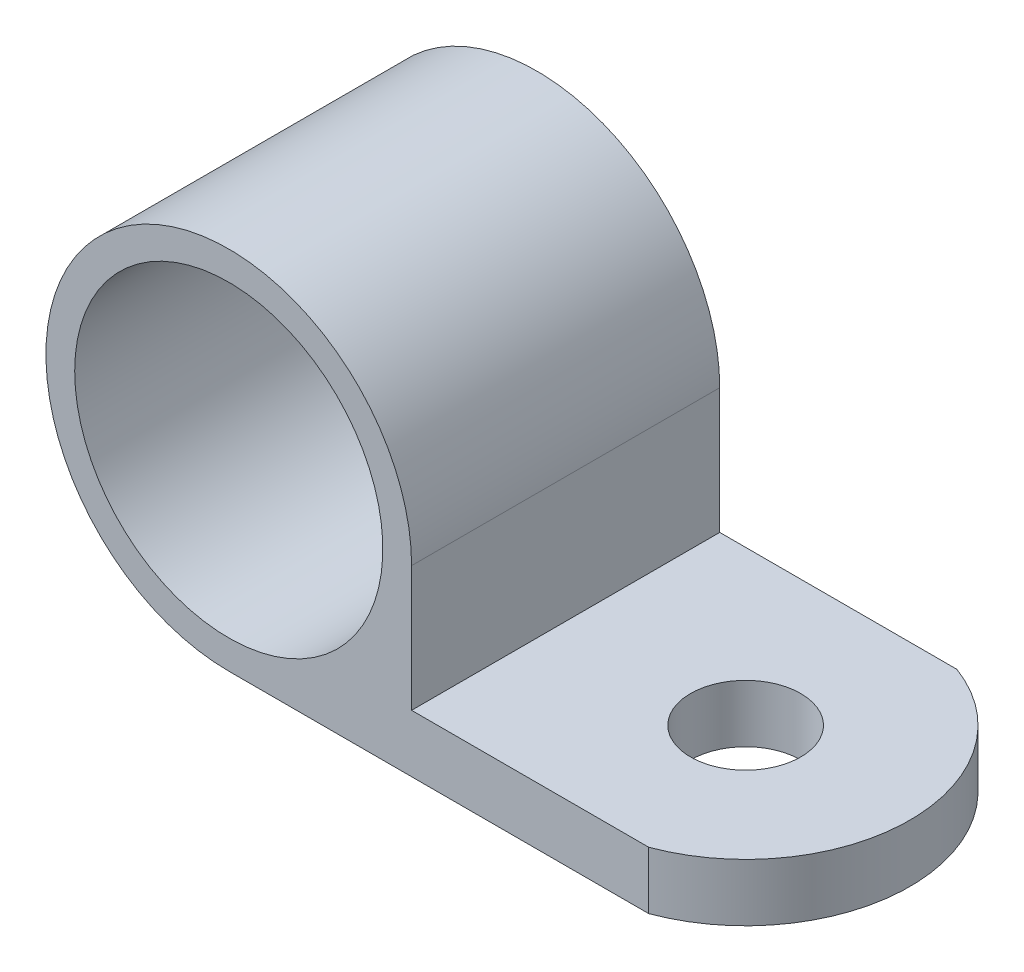
ISO-10303-21;
HEADER;
FILE_DESCRIPTION(('STEP AP214'),'2;1');
FILE_NAME('part.step','',(''),(''),'','','');
FILE_SCHEMA(('AUTOMOTIVE_DESIGN { 1 0 10303 214 1 1 1 1 }'));
ENDSEC;
DATA;
#1=APPLICATION_CONTEXT('core data for automotive mechanical design processes');
#2=APPLICATION_PROTOCOL_DEFINITION('international standard','automotive_design',2000,#1);
#3=PRODUCT_CONTEXT('',#1,'mechanical');
#4=PRODUCT('Part','Part','',(#3));
#5=PRODUCT_RELATED_PRODUCT_CATEGORY('part','',(#4));
#6=PRODUCT_DEFINITION_FORMATION('','',#4);
#7=PRODUCT_DEFINITION_CONTEXT('part definition',#1,'design');
#8=PRODUCT_DEFINITION('design','',#6,#7);
#9=PRODUCT_DEFINITION_SHAPE('','',#8);
#10=(LENGTH_UNIT() NAMED_UNIT(*) SI_UNIT(.MILLI.,.METRE.));
#11=(NAMED_UNIT(*) PLANE_ANGLE_UNIT() SI_UNIT($,.RADIAN.));
#12=(NAMED_UNIT(*) SI_UNIT($,.STERADIAN.) SOLID_ANGLE_UNIT());
#13=UNCERTAINTY_MEASURE_WITH_UNIT(LENGTH_MEASURE(1.E-05),#10,'distance_accuracy_value','');
#14=(GEOMETRIC_REPRESENTATION_CONTEXT(3) GLOBAL_UNCERTAINTY_ASSIGNED_CONTEXT((#13)) GLOBAL_UNIT_ASSIGNED_CONTEXT((#10,
#11,#12)) REPRESENTATION_CONTEXT('',''));
#15=CARTESIAN_POINT('',(0.,0.,0.));
#16=DIRECTION('',(0.,0.,1.));
#17=DIRECTION('',(1.,0.,0.));
#18=AXIS2_PLACEMENT_3D('',#15,#16,#17);
#19=CARTESIAN_POINT('',(-5.5626,1.778,4.7625));
#20=DIRECTION('',(0.,-1.,0.));
#21=DIRECTION('',(1.,0.,0.));
#22=AXIS2_PLACEMENT_3D('',#19,#20,#21);
#23=PLANE('',#22);
#24=CARTESIAN_POINT('',(0.,1.778,0.));
#25=DIRECTION('',(0.,-1.,0.));
#26=DIRECTION('',(1.,0.,0.));
#27=AXIS2_PLACEMENT_3D('',#24,#25,#26);
#28=CIRCLE('',#27,1.7018);
#29=CARTESIAN_POINT('',(0.,1.778,-1.7018));
#30=VERTEX_POINT('',#29);
#31=EDGE_CURVE('E130',#30,#30,#28,.F.);
#32=ORIENTED_EDGE('',*,*,#31,.F.);
#33=EDGE_LOOP('',(#32));
#34=FACE_BOUND('',#33,.T.);
#35=CARTESIAN_POINT('',(0.,1.778,0.));
#36=DIRECTION('',(0.,-1.,0.));
#37=DIRECTION('',(1.,0.,0.));
#38=AXIS2_PLACEMENT_3D('',#35,#36,#37);
#39=CIRCLE('',#38,5.08);
#40=CARTESIAN_POINT('',(1.76776518519853,1.778,-4.7625));
#41=VERTEX_POINT('',#40);
#42=CARTESIAN_POINT('',(1.76776518519853,1.778,4.7625));
#43=VERTEX_POINT('',#42);
#44=EDGE_CURVE('E89',#41,#43,#39,.T.);
#45=ORIENTED_EDGE('',*,*,#44,.F.);
#46=DIRECTION('',(-1.,0.,0.));
#47=VECTOR('',#46,1.);
#48=CARTESIAN_POINT('',(-5.5626,1.778,-4.7625));
#49=LINE('',#48,#47);
#50=CARTESIAN_POINT('',(-5.5626,1.778,-4.7625));
#51=VERTEX_POINT('',#50);
#52=EDGE_CURVE('E109',#41,#51,#49,.T.);
#53=ORIENTED_EDGE('',*,*,#52,.T.);
#54=DIRECTION('',(0.,0.,-1.));
#55=VECTOR('',#54,1.);
#56=CARTESIAN_POINT('',(-5.5626,1.778,4.7625));
#57=LINE('',#56,#55);
#58=CARTESIAN_POINT('',(-5.5626,1.778,4.7625));
#59=VERTEX_POINT('',#58);
#60=EDGE_CURVE('E41',#59,#51,#57,.T.);
#61=ORIENTED_EDGE('',*,*,#60,.F.);
#62=DIRECTION('',(-1.,0.,0.));
#63=VECTOR('',#62,1.);
#64=CARTESIAN_POINT('',(-5.5626,1.778,4.7625));
#65=LINE('',#64,#63);
#66=EDGE_CURVE('E78',#43,#59,#65,.T.);
#67=ORIENTED_EDGE('',*,*,#66,.F.);
#68=EDGE_LOOP('',(#45,#53,#61,#67));
#69=FACE_BOUND('',#68,.T.);
#70=ADVANCED_FACE('F34',(#34,#69),#23,.F.);
#71=CARTESIAN_POINT('',(6.35,0.,4.7625));
#72=DIRECTION('',(0.,1.,0.));
#73=DIRECTION('',(-1.,0.,0.));
#74=AXIS2_PLACEMENT_3D('',#71,#72,#73);
#75=PLANE('',#74);
#76=CARTESIAN_POINT('',(0.,0.,0.));
#77=DIRECTION('',(0.,1.,0.));
#78=DIRECTION('',(0.,0.,1.));
#79=AXIS2_PLACEMENT_3D('',#76,#77,#78);
#80=CIRCLE('',#79,1.7018);
#81=CARTESIAN_POINT('',(0.,0.,-1.7018));
#82=VERTEX_POINT('',#81);
#83=EDGE_CURVE('E90',#82,#82,#80,.T.);
#84=ORIENTED_EDGE('',*,*,#83,.T.);
#85=EDGE_LOOP('',(#84));
#86=FACE_BOUND('',#85,.T.);
#87=CARTESIAN_POINT('',(0.,0.,0.));
#88=DIRECTION('',(0.,-1.,0.));
#89=DIRECTION('',(0.,0.,1.));
#90=AXIS2_PLACEMENT_3D('',#87,#88,#89);
#91=CIRCLE('',#90,5.08);
#92=CARTESIAN_POINT('',(1.76776518519853,0.,-4.7625));
#93=VERTEX_POINT('',#92);
#94=CARTESIAN_POINT('',(1.76776518519853,0.,4.7625));
#95=VERTEX_POINT('',#94);
#96=EDGE_CURVE('E48',#93,#95,#91,.T.);
#97=ORIENTED_EDGE('',*,*,#96,.T.);
#98=DIRECTION('',(1.,0.,0.));
#99=VECTOR('',#98,1.);
#100=CARTESIAN_POINT('',(6.35,0.,4.7625));
#101=LINE('',#100,#99);
#102=CARTESIAN_POINT('',(-11.2141,0.,4.7625));
#103=VERTEX_POINT('',#102);
#104=EDGE_CURVE('E96',#103,#95,#101,.T.);
#105=ORIENTED_EDGE('',*,*,#104,.F.);
#106=DIRECTION('',(0.,0.,-1.));
#107=VECTOR('',#106,1.);
#108=CARTESIAN_POINT('',(-11.2141,0.,4.7625));
#109=LINE('',#108,#107);
#110=CARTESIAN_POINT('',(-11.2141,0.,-4.7625));
#111=VERTEX_POINT('',#110);
#112=EDGE_CURVE('E101',#103,#111,#109,.T.);
#113=ORIENTED_EDGE('',*,*,#112,.T.);
#114=DIRECTION('',(1.,0.,0.));
#115=VECTOR('',#114,1.);
#116=CARTESIAN_POINT('',(6.35,0.,-4.7625));
#117=LINE('',#116,#115);
#118=EDGE_CURVE('E98',#111,#93,#117,.T.);
#119=ORIENTED_EDGE('',*,*,#118,.T.);
#120=EDGE_LOOP('',(#97,#105,#113,#119));
#121=FACE_BOUND('',#120,.T.);
#122=ADVANCED_FACE('F95',(#86,#121),#75,.F.);
#123=CARTESIAN_POINT('',(-11.2141,5.6515,4.7625));
#124=DIRECTION('',(0.,0.,-1.));
#125=DIRECTION('',(-1.,0.,0.));
#126=AXIS2_PLACEMENT_3D('',#123,#124,#125);
#127=PLANE('',#126);
#128=CARTESIAN_POINT('',(-11.2141,5.6515,4.7625));
#129=DIRECTION('',(0.,0.,1.));
#130=DIRECTION('',(1.,0.,0.));
#131=AXIS2_PLACEMENT_3D('',#128,#129,#130);
#132=CIRCLE('',#131,4.7625);
#133=CARTESIAN_POINT('',(-15.9766,5.6515,4.7625));
#134=VERTEX_POINT('',#133);
#135=EDGE_CURVE('E112',#134,#134,#132,.T.);
#136=ORIENTED_EDGE('',*,*,#135,.F.);
#137=EDGE_LOOP('',(#136));
#138=FACE_BOUND('',#137,.T.);
#139=DIRECTION('',(0.,-1.,0.));
#140=VECTOR('',#139,1.);
#141=CARTESIAN_POINT('',(1.76776518519853,11.303,4.7625));
#142=LINE('',#141,#140);
#143=EDGE_CURVE('E86',#43,#95,#142,.T.);
#144=ORIENTED_EDGE('',*,*,#143,.F.);
#145=ORIENTED_EDGE('',*,*,#66,.T.);
#146=DIRECTION('',(0.,1.,0.));
#147=VECTOR('',#146,1.);
#148=CARTESIAN_POINT('',(-5.5626,5.6515,4.7625));
#149=LINE('',#148,#147);
#150=CARTESIAN_POINT('',(-5.5626,5.6515,4.7625));
#151=VERTEX_POINT('',#150);
#152=EDGE_CURVE('E105',#59,#151,#149,.T.);
#153=ORIENTED_EDGE('',*,*,#152,.T.);
#154=CARTESIAN_POINT('',(-11.2141,5.6515,4.7625));
#155=DIRECTION('',(0.,0.,1.));
#156=DIRECTION('',(-1.,0.,0.));
#157=AXIS2_PLACEMENT_3D('',#154,#155,#156);
#158=CIRCLE('',#157,5.6515);
#159=EDGE_CURVE('E56',#151,#103,#158,.T.);
#160=ORIENTED_EDGE('',*,*,#159,.T.);
#161=ORIENTED_EDGE('',*,*,#104,.T.);
#162=EDGE_LOOP('',(#144,#145,#153,#160,#161));
#163=FACE_BOUND('',#162,.T.);
#164=ADVANCED_FACE('F100',(#138,#163),#127,.F.);
#165=CARTESIAN_POINT('',(-11.2141,5.6515,-4.7625));
#166=DIRECTION('',(0.,0.,-1.));
#167=DIRECTION('',(-1.,0.,0.));
#168=AXIS2_PLACEMENT_3D('',#165,#166,#167);
#169=PLANE('',#168);
#170=CARTESIAN_POINT('',(-11.2141,5.6515,-4.7625));
#171=DIRECTION('',(0.,0.,1.));
#172=DIRECTION('',(1.,0.,0.));
#173=AXIS2_PLACEMENT_3D('',#170,#171,#172);
#174=CIRCLE('',#173,4.7625);
#175=CARTESIAN_POINT('',(-15.9766,5.6515,-4.7625));
#176=VERTEX_POINT('',#175);
#177=EDGE_CURVE('E133',#176,#176,#174,.T.);
#178=ORIENTED_EDGE('',*,*,#177,.T.);
#179=EDGE_LOOP('',(#178));
#180=FACE_BOUND('',#179,.T.);
#181=ORIENTED_EDGE('',*,*,#52,.F.);
#182=DIRECTION('',(0.,-1.,0.));
#183=VECTOR('',#182,1.);
#184=CARTESIAN_POINT('',(1.76776518519853,11.303,-4.7625));
#185=LINE('',#184,#183);
#186=EDGE_CURVE('E11',#41,#93,#185,.T.);
#187=ORIENTED_EDGE('',*,*,#186,.T.);
#188=ORIENTED_EDGE('',*,*,#118,.F.);
#189=CARTESIAN_POINT('',(-11.2141,5.6515,-4.7625));
#190=DIRECTION('',(0.,0.,1.));
#191=DIRECTION('',(-1.,0.,0.));
#192=AXIS2_PLACEMENT_3D('',#189,#190,#191);
#193=CIRCLE('',#192,5.6515);
#194=CARTESIAN_POINT('',(-5.5626,5.6515,-4.7625));
#195=VERTEX_POINT('',#194);
#196=EDGE_CURVE('E73',#195,#111,#193,.T.);
#197=ORIENTED_EDGE('',*,*,#196,.F.);
#198=DIRECTION('',(0.,1.,0.));
#199=VECTOR('',#198,1.);
#200=CARTESIAN_POINT('',(-5.5626,5.6515,-4.7625));
#201=LINE('',#200,#199);
#202=EDGE_CURVE('E111',#51,#195,#201,.T.);
#203=ORIENTED_EDGE('',*,*,#202,.F.);
#204=EDGE_LOOP('',(#181,#187,#188,#197,#203));
#205=FACE_BOUND('',#204,.T.);
#206=ADVANCED_FACE('F125',(#180,#205),#169,.T.);
#207=CARTESIAN_POINT('',(-5.5626,5.6515,4.7625));
#208=DIRECTION('',(-1.,0.,0.));
#209=DIRECTION('',(0.,0.,1.));
#210=AXIS2_PLACEMENT_3D('',#207,#208,#209);
#211=PLANE('',#210);
#212=ORIENTED_EDGE('',*,*,#202,.T.);
#213=DIRECTION('',(0.,0.,-1.));
#214=VECTOR('',#213,1.);
#215=CARTESIAN_POINT('',(-5.5626,5.6515,4.7625));
#216=LINE('',#215,#214);
#217=EDGE_CURVE('E103',#151,#195,#216,.T.);
#218=ORIENTED_EDGE('',*,*,#217,.F.);
#219=ORIENTED_EDGE('',*,*,#152,.F.);
#220=ORIENTED_EDGE('',*,*,#60,.T.);
#221=EDGE_LOOP('',(#212,#218,#219,#220));
#222=FACE_BOUND('',#221,.T.);
#223=ADVANCED_FACE('F120',(#222),#211,.F.);
#224=CARTESIAN_POINT('',(-11.2141,5.6515,4.7625));
#225=DIRECTION('',(0.,0.,-1.));
#226=DIRECTION('',(-1.,0.,0.));
#227=AXIS2_PLACEMENT_3D('',#224,#225,#226);
#228=CYLINDRICAL_SURFACE('',#227,5.6515);
#229=ORIENTED_EDGE('',*,*,#196,.T.);
#230=ORIENTED_EDGE('',*,*,#112,.F.);
#231=ORIENTED_EDGE('',*,*,#159,.F.);
#232=ORIENTED_EDGE('',*,*,#217,.T.);
#233=EDGE_LOOP('',(#229,#230,#231,#232));
#234=FACE_BOUND('',#233,.T.);
#235=ADVANCED_FACE('F138',(#234),#228,.T.);
#236=CARTESIAN_POINT('',(-11.2141,5.6515,4.7625));
#237=DIRECTION('',(0.,0.,-1.));
#238=DIRECTION('',(-1.,0.,0.));
#239=AXIS2_PLACEMENT_3D('',#236,#237,#238);
#240=CYLINDRICAL_SURFACE('',#239,4.7625);
#241=CARTESIAN_POINT('',(-15.9766,5.6515,4.7625));
#242=CARTESIAN_POINT('',(-15.9766,5.6515,4.66328125));
#243=CARTESIAN_POINT('',(-15.9766,5.6515,4.5640625));
#244=CARTESIAN_POINT('',(-15.9766,5.6515,4.365625));
#245=CARTESIAN_POINT('',(-15.9766,5.6515,4.26640625));
#246=CARTESIAN_POINT('',(-15.9766,5.6515,4.06796875));
#247=CARTESIAN_POINT('',(-15.9766,5.6515,3.96875));
#248=CARTESIAN_POINT('',(-15.9766,5.6515,3.7703125));
#249=CARTESIAN_POINT('',(-15.9766,5.6515,3.67109375));
#250=CARTESIAN_POINT('',(-15.9766,5.6515,3.47265625));
#251=CARTESIAN_POINT('',(-15.9766,5.6515,3.3734375));
#252=CARTESIAN_POINT('',(-15.9766,5.6515,3.175));
#253=CARTESIAN_POINT('',(-15.9766,5.6515,3.07578125));
#254=CARTESIAN_POINT('',(-15.9766,5.6515,2.87734375));
#255=CARTESIAN_POINT('',(-15.9766,5.6515,2.778125));
#256=CARTESIAN_POINT('',(-15.9766,5.6515,2.5796875));
#257=CARTESIAN_POINT('',(-15.9766,5.6515,2.48046875));
#258=CARTESIAN_POINT('',(-15.9766,5.6515,2.28203125));
#259=CARTESIAN_POINT('',(-15.9766,5.6515,2.1828125));
#260=CARTESIAN_POINT('',(-15.9766,5.6515,1.984375));
#261=CARTESIAN_POINT('',(-15.9766,5.6515,1.88515625));
#262=CARTESIAN_POINT('',(-15.9766,5.6515,1.68671875));
#263=CARTESIAN_POINT('',(-15.9766,5.6515,1.5875));
#264=CARTESIAN_POINT('',(-15.9766,5.6515,1.3890625));
#265=CARTESIAN_POINT('',(-15.9766,5.6515,1.28984375));
#266=CARTESIAN_POINT('',(-15.9766,5.6515,1.09140625));
#267=CARTESIAN_POINT('',(-15.9766,5.6515,0.992187499999999));
#268=CARTESIAN_POINT('',(-15.9766,5.6515,0.79375));
#269=CARTESIAN_POINT('',(-15.9766,5.6515,0.69453125));
#270=CARTESIAN_POINT('',(-15.9766,5.6515,0.49609375));
#271=CARTESIAN_POINT('',(-15.9766,5.6515,0.396875));
#272=CARTESIAN_POINT('',(-15.9766,5.6515,0.1984375));
#273=CARTESIAN_POINT('',(-15.9766,5.6515,0.0992187500000001));
#274=CARTESIAN_POINT('',(-15.9766,5.6515,-0.0992187500000001));
#275=CARTESIAN_POINT('',(-15.9766,5.6515,-0.1984375));
#276=CARTESIAN_POINT('',(-15.9766,5.6515,-0.396875));
#277=CARTESIAN_POINT('',(-15.9766,5.6515,-0.49609375));
#278=CARTESIAN_POINT('',(-15.9766,5.6515,-0.69453125));
#279=CARTESIAN_POINT('',(-15.9766,5.6515,-0.793750000000001));
#280=CARTESIAN_POINT('',(-15.9766,5.6515,-0.992187500000001));
#281=CARTESIAN_POINT('',(-15.9766,5.6515,-1.09140625));
#282=CARTESIAN_POINT('',(-15.9766,5.6515,-1.28984375));
#283=CARTESIAN_POINT('',(-15.9766,5.6515,-1.3890625));
#284=CARTESIAN_POINT('',(-15.9766,5.6515,-1.5875));
#285=CARTESIAN_POINT('',(-15.9766,5.6515,-1.68671875));
#286=CARTESIAN_POINT('',(-15.9766,5.6515,-1.88515625));
#287=CARTESIAN_POINT('',(-15.9766,5.6515,-1.984375));
#288=CARTESIAN_POINT('',(-15.9766,5.6515,-2.1828125));
#289=CARTESIAN_POINT('',(-15.9766,5.6515,-2.28203125));
#290=CARTESIAN_POINT('',(-15.9766,5.6515,-2.48046875));
#291=CARTESIAN_POINT('',(-15.9766,5.6515,-2.5796875));
#292=CARTESIAN_POINT('',(-15.9766,5.6515,-2.778125));
#293=CARTESIAN_POINT('',(-15.9766,5.6515,-2.87734375));
#294=CARTESIAN_POINT('',(-15.9766,5.6515,-3.07578125));
#295=CARTESIAN_POINT('',(-15.9766,5.6515,-3.175));
#296=CARTESIAN_POINT('',(-15.9766,5.6515,-3.3734375));
#297=CARTESIAN_POINT('',(-15.9766,5.6515,-3.47265625));
#298=CARTESIAN_POINT('',(-15.9766,5.6515,-3.67109375));
#299=CARTESIAN_POINT('',(-15.9766,5.6515,-3.7703125));
#300=CARTESIAN_POINT('',(-15.9766,5.6515,-3.96875));
#301=CARTESIAN_POINT('',(-15.9766,5.6515,-4.06796875));
#302=CARTESIAN_POINT('',(-15.9766,5.6515,-4.26640625));
#303=CARTESIAN_POINT('',(-15.9766,5.6515,-4.365625));
#304=CARTESIAN_POINT('',(-15.9766,5.6515,-4.5640625));
#305=CARTESIAN_POINT('',(-15.9766,5.6515,-4.66328125));
#306=CARTESIAN_POINT('',(-15.9766,5.6515,-4.7625));
#307=B_SPLINE_CURVE_WITH_KNOTS('',3,(#241,#242,#243,#244,#245,#246,#247,#248,#249,#250,#251,
#252,#253,#254,#255,#256,#257,#258,#259,#260,#261,#262,#263,#264,#265,#266,#267,#268,#269,#270,
#271,#272,#273,#274,#275,#276,#277,#278,#279,#280,#281,#282,#283,#284,#285,#286,#287,#288,#289,
#290,#291,#292,#293,#294,#295,#296,#297,#298,#299,#300,#301,#302,#303,#304,#305,#306),
.UNSPECIFIED.,.F.,.F.,(4,2,2,2,2,2,2,2,2,2,2,2,2,2,2,2,2,2,2,2,2,2,2,2,2,2,2,2,2,2,2,2,4),(0.,
0.29765625,0.5953125,0.892968750000001,1.190625,1.48828125,1.7859375,2.08359375,2.38125,
2.67890625,2.9765625,3.27421875,3.571875,3.86953125,4.1671875,4.46484375,4.7625,5.06015625,
5.3578125,5.65546875,5.953125,6.25078125,6.5484375,6.84609375,7.14375,7.44140625,7.7390625,
8.03671875,8.334375,8.63203125,8.9296875,9.22734375,9.525),.UNSPECIFIED.);
#308=EDGE_CURVE('BSEAM140',#134,#176,#307,.T.);
#309=ORIENTED_EDGE('',*,*,#135,.T.);
#310=ORIENTED_EDGE('',*,*,#177,.F.);
#311=ORIENTED_EDGE('',*,*,#308,.T.);
#312=ORIENTED_EDGE('',*,*,#308,.F.);
#313=EDGE_LOOP('',(#309,#311,#310,#312));
#314=FACE_BOUND('',#313,.T.);
#315=ADVANCED_FACE('F140',(#314),#240,.F.);
#316=CARTESIAN_POINT('',(0.,11.303,0.));
#317=DIRECTION('',(0.,-1.,0.));
#318=DIRECTION('',(0.,0.,-1.));
#319=AXIS2_PLACEMENT_3D('',#316,#317,#318);
#320=CYLINDRICAL_SURFACE('',#319,1.7018);
#321=CARTESIAN_POINT('',(0.,0.,-1.7018));
#322=CARTESIAN_POINT('',(0.,0.0185208333333334,-1.7018));
#323=CARTESIAN_POINT('',(0.,0.0370416666666667,-1.7018));
#324=CARTESIAN_POINT('',(0.,0.0740833333333334,-1.7018));
#325=CARTESIAN_POINT('',(0.,0.0926041666666668,-1.7018));
#326=CARTESIAN_POINT('',(0.,0.129645833333333,-1.7018));
#327=CARTESIAN_POINT('',(0.,0.148166666666667,-1.7018));
#328=CARTESIAN_POINT('',(0.,0.185208333333334,-1.7018));
#329=CARTESIAN_POINT('',(0.,0.203729166666667,-1.7018));
#330=CARTESIAN_POINT('',(0.,0.240770833333334,-1.7018));
#331=CARTESIAN_POINT('',(0.,0.259291666666667,-1.7018));
#332=CARTESIAN_POINT('',(0.,0.296333333333334,-1.7018));
#333=CARTESIAN_POINT('',(0.,0.314854166666667,-1.7018));
#334=CARTESIAN_POINT('',(0.,0.351895833333334,-1.7018));
#335=CARTESIAN_POINT('',(0.,0.370416666666667,-1.7018));
#336=CARTESIAN_POINT('',(0.,0.407458333333334,-1.7018));
#337=CARTESIAN_POINT('',(0.,0.425979166666667,-1.7018));
#338=CARTESIAN_POINT('',(0.,0.463020833333334,-1.7018));
#339=CARTESIAN_POINT('',(0.,0.481541666666667,-1.7018));
#340=CARTESIAN_POINT('',(0.,0.518583333333334,-1.7018));
#341=CARTESIAN_POINT('',(0.,0.537104166666667,-1.7018));
#342=CARTESIAN_POINT('',(0.,0.574145833333334,-1.7018));
#343=CARTESIAN_POINT('',(0.,0.592666666666667,-1.7018));
#344=CARTESIAN_POINT('',(0.,0.629708333333334,-1.7018));
#345=CARTESIAN_POINT('',(0.,0.648229166666667,-1.7018));
#346=CARTESIAN_POINT('',(0.,0.685270833333334,-1.7018));
#347=CARTESIAN_POINT('',(0.,0.703791666666667,-1.7018));
#348=CARTESIAN_POINT('',(0.,0.740833333333334,-1.7018));
#349=CARTESIAN_POINT('',(0.,0.759354166666667,-1.7018));
#350=CARTESIAN_POINT('',(0.,0.796395833333334,-1.7018));
#351=CARTESIAN_POINT('',(0.,0.814916666666668,-1.7018));
#352=CARTESIAN_POINT('',(0.,0.851958333333334,-1.7018));
#353=CARTESIAN_POINT('',(0.,0.870479166666667,-1.7018));
#354=CARTESIAN_POINT('',(0.,0.907520833333334,-1.7018));
#355=CARTESIAN_POINT('',(0.,0.926041666666668,-1.7018));
#356=CARTESIAN_POINT('',(0.,0.963083333333334,-1.7018));
#357=CARTESIAN_POINT('',(0.,0.981604166666668,-1.7018));
#358=CARTESIAN_POINT('',(0.,1.01864583333333,-1.7018));
#359=CARTESIAN_POINT('',(0.,1.03716666666667,-1.7018));
#360=CARTESIAN_POINT('',(0.,1.07420833333333,-1.7018));
#361=CARTESIAN_POINT('',(0.,1.09272916666667,-1.7018));
#362=CARTESIAN_POINT('',(0.,1.12977083333333,-1.7018));
#363=CARTESIAN_POINT('',(0.,1.14829166666667,-1.7018));
#364=CARTESIAN_POINT('',(0.,1.18533333333333,-1.7018));
#365=CARTESIAN_POINT('',(0.,1.20385416666667,-1.7018));
#366=CARTESIAN_POINT('',(0.,1.24089583333333,-1.7018));
#367=CARTESIAN_POINT('',(0.,1.25941666666667,-1.7018));
#368=CARTESIAN_POINT('',(0.,1.29645833333333,-1.7018));
#369=CARTESIAN_POINT('',(0.,1.31497916666667,-1.7018));
#370=CARTESIAN_POINT('',(0.,1.35202083333333,-1.7018));
#371=CARTESIAN_POINT('',(0.,1.37054166666667,-1.7018));
#372=CARTESIAN_POINT('',(0.,1.40758333333333,-1.7018));
#373=CARTESIAN_POINT('',(0.,1.42610416666667,-1.7018));
#374=CARTESIAN_POINT('',(0.,1.46314583333333,-1.7018));
#375=CARTESIAN_POINT('',(0.,1.48166666666667,-1.7018));
#376=CARTESIAN_POINT('',(0.,1.51870833333333,-1.7018));
#377=CARTESIAN_POINT('',(0.,1.53722916666667,-1.7018));
#378=CARTESIAN_POINT('',(0.,1.57427083333333,-1.7018));
#379=CARTESIAN_POINT('',(0.,1.59279166666667,-1.7018));
#380=CARTESIAN_POINT('',(0.,1.62983333333334,-1.7018));
#381=CARTESIAN_POINT('',(0.,1.64835416666667,-1.7018));
#382=CARTESIAN_POINT('',(0.,1.68539583333333,-1.7018));
#383=CARTESIAN_POINT('',(0.,1.70391666666667,-1.7018));
#384=CARTESIAN_POINT('',(0.,1.74095833333333,-1.7018));
#385=CARTESIAN_POINT('',(0.,1.75947916666667,-1.7018));
#386=CARTESIAN_POINT('',(0.,1.778,-1.7018));
#387=B_SPLINE_CURVE_WITH_KNOTS('',3,(#321,#322,#323,#324,#325,#326,#327,#328,#329,#330,#331,
#332,#333,#334,#335,#336,#337,#338,#339,#340,#341,#342,#343,#344,#345,#346,#347,#348,#349,#350,
#351,#352,#353,#354,#355,#356,#357,#358,#359,#360,#361,#362,#363,#364,#365,#366,#367,#368,#369,
#370,#371,#372,#373,#374,#375,#376,#377,#378,#379,#380,#381,#382,#383,#384,#385,#386),
.UNSPECIFIED.,.F.,.F.,(4,2,2,2,2,2,2,2,2,2,2,2,2,2,2,2,2,2,2,2,2,2,2,2,2,2,2,2,2,2,2,2,4),(0.,
0.0555625000000001,0.111125,0.1666875,0.22225,0.2778125,0.333375,0.3889375,0.4445,
0.500062500000001,0.555625000000001,0.611187500000001,0.666750000000001,0.722312500000001,
0.777875000000001,0.833437500000001,0.889000000000001,0.944562500000001,1.000125,1.0556875,
1.11125,1.1668125,1.222375,1.2779375,1.3335,1.3890625,1.444625,1.5001875,1.55575,1.6113125,
1.666875,1.7224375,1.778),.UNSPECIFIED.);
#388=EDGE_CURVE('BSEAM146',#82,#30,#387,.T.);
#389=ORIENTED_EDGE('',*,*,#83,.F.);
#390=ORIENTED_EDGE('',*,*,#31,.T.);
#391=ORIENTED_EDGE('',*,*,#388,.T.);
#392=ORIENTED_EDGE('',*,*,#388,.F.);
#393=EDGE_LOOP('',(#389,#391,#390,#392));
#394=FACE_BOUND('',#393,.T.);
#395=ADVANCED_FACE('F146',(#394),#320,.F.);
#396=CARTESIAN_POINT('',(0.,11.303,0.));
#397=DIRECTION('',(0.,-1.,0.));
#398=DIRECTION('',(0.,0.,-1.));
#399=AXIS2_PLACEMENT_3D('',#396,#397,#398);
#400=CYLINDRICAL_SURFACE('',#399,5.08);
#401=ORIENTED_EDGE('',*,*,#143,.T.);
#402=ORIENTED_EDGE('',*,*,#96,.F.);
#403=ORIENTED_EDGE('',*,*,#186,.F.);
#404=ORIENTED_EDGE('',*,*,#44,.T.);
#405=EDGE_LOOP('',(#401,#402,#403,#404));
#406=FACE_BOUND('',#405,.T.);
#407=ADVANCED_FACE('F87',(#406),#400,.T.);
#408=CLOSED_SHELL('',(#70,#122,#164,#206,#223,#235,#315,#395,#407));
#409=MANIFOLD_SOLID_BREP('B2',#408);
#410=ADVANCED_BREP_SHAPE_REPRESENTATION('',(#18,#409),#14);
#411=SHAPE_DEFINITION_REPRESENTATION(#9,#410);
ENDSEC;
END-ISO-10303-21;
